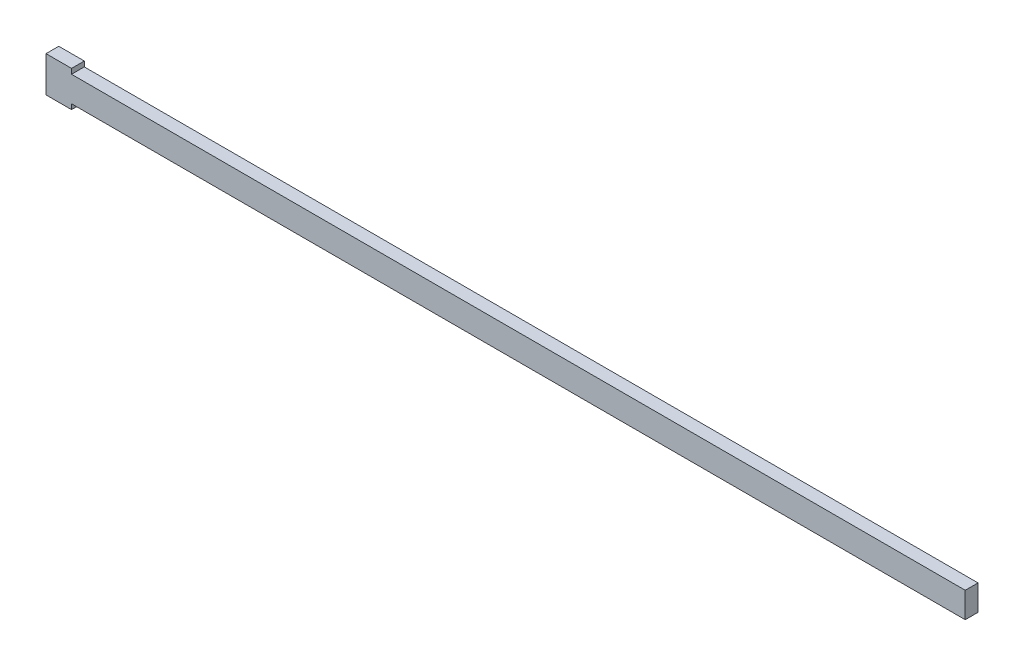
ISO-10303-21;
HEADER;
FILE_DESCRIPTION(('STEP AP214'),'2;1');
FILE_NAME('part.step','',(''),(''),'','','');
FILE_SCHEMA(('AUTOMOTIVE_DESIGN { 1 0 10303 214 1 1 1 1 }'));
ENDSEC;
DATA;
#1=APPLICATION_CONTEXT('core data for automotive mechanical design processes');
#2=APPLICATION_PROTOCOL_DEFINITION('international standard','automotive_design',2000,#1);
#3=PRODUCT_CONTEXT('',#1,'mechanical');
#4=PRODUCT('Part','Part','',(#3));
#5=PRODUCT_RELATED_PRODUCT_CATEGORY('part','',(#4));
#6=PRODUCT_DEFINITION_FORMATION('','',#4);
#7=PRODUCT_DEFINITION_CONTEXT('part definition',#1,'design');
#8=PRODUCT_DEFINITION('design','',#6,#7);
#9=PRODUCT_DEFINITION_SHAPE('','',#8);
#10=(LENGTH_UNIT() NAMED_UNIT(*) SI_UNIT(.MILLI.,.METRE.));
#11=(NAMED_UNIT(*) PLANE_ANGLE_UNIT() SI_UNIT($,.RADIAN.));
#12=(NAMED_UNIT(*) SI_UNIT($,.STERADIAN.) SOLID_ANGLE_UNIT());
#13=UNCERTAINTY_MEASURE_WITH_UNIT(LENGTH_MEASURE(1.E-05),#10,'distance_accuracy_value','');
#14=(GEOMETRIC_REPRESENTATION_CONTEXT(3) GLOBAL_UNCERTAINTY_ASSIGNED_CONTEXT((#13)) GLOBAL_UNIT_ASSIGNED_CONTEXT((#10,
#11,#12)) REPRESENTATION_CONTEXT('',''));
#15=CARTESIAN_POINT('',(0.,0.,0.));
#16=DIRECTION('',(0.,0.,1.));
#17=DIRECTION('',(1.,0.,0.));
#18=AXIS2_PLACEMENT_3D('',#15,#16,#17);
#19=CARTESIAN_POINT('',(0.,-2.54,6.35));
#20=DIRECTION('',(0.,1.,0.));
#21=DIRECTION('',(0.,0.,1.));
#22=AXIS2_PLACEMENT_3D('',#19,#20,#21);
#23=PLANE('',#22);
#24=DIRECTION('',(1.,0.,0.));
#25=VECTOR('',#24,1.);
#26=CARTESIAN_POINT('',(0.,-2.54,0.));
#27=LINE('',#26,#25);
#28=CARTESIAN_POINT('',(0.,-2.54,0.));
#29=VERTEX_POINT('',#28);
#30=CARTESIAN_POINT('',(12.7,-2.54,0.));
#31=VERTEX_POINT('',#30);
#32=EDGE_CURVE('E139',#29,#31,#27,.T.);
#33=ORIENTED_EDGE('',*,*,#32,.T.);
#34=DIRECTION('',(0.,0.,-1.));
#35=VECTOR('',#34,1.);
#36=CARTESIAN_POINT('',(12.7,-2.54,6.35));
#37=LINE('',#36,#35);
#38=CARTESIAN_POINT('',(12.7,-2.54,6.35));
#39=VERTEX_POINT('',#38);
#40=EDGE_CURVE('E46',#39,#31,#37,.T.);
#41=ORIENTED_EDGE('',*,*,#40,.F.);
#42=DIRECTION('',(1.,0.,0.));
#43=VECTOR('',#42,1.);
#44=CARTESIAN_POINT('',(0.,-2.54,6.35));
#45=LINE('',#44,#43);
#46=CARTESIAN_POINT('',(0.,-2.54,6.35));
#47=VERTEX_POINT('',#46);
#48=EDGE_CURVE('E99',#47,#39,#45,.T.);
#49=ORIENTED_EDGE('',*,*,#48,.F.);
#50=DIRECTION('',(0.,0.,-1.));
#51=VECTOR('',#50,1.);
#52=CARTESIAN_POINT('',(0.,-2.54,6.35));
#53=LINE('',#52,#51);
#54=EDGE_CURVE('E11',#47,#29,#53,.T.);
#55=ORIENTED_EDGE('',*,*,#54,.T.);
#56=EDGE_LOOP('',(#33,#41,#49,#55));
#57=FACE_BOUND('',#56,.T.);
#58=ADVANCED_FACE('F38',(#57),#23,.F.);
#59=CARTESIAN_POINT('',(12.7,0.,6.35));
#60=DIRECTION('',(-1.,0.,0.));
#61=DIRECTION('',(0.,0.,1.));
#62=AXIS2_PLACEMENT_3D('',#59,#60,#61);
#63=PLANE('',#62);
#64=DIRECTION('',(0.,1.,0.));
#65=VECTOR('',#64,1.);
#66=CARTESIAN_POINT('',(12.7,0.,0.));
#67=LINE('',#66,#65);
#68=CARTESIAN_POINT('',(12.7,0.,0.));
#69=VERTEX_POINT('',#68);
#70=EDGE_CURVE('E141',#31,#69,#67,.T.);
#71=ORIENTED_EDGE('',*,*,#70,.T.);
#72=DIRECTION('',(0.,0.,-1.));
#73=VECTOR('',#72,1.);
#74=CARTESIAN_POINT('',(12.7,0.,6.35));
#75=LINE('',#74,#73);
#76=CARTESIAN_POINT('',(12.7,0.,6.35));
#77=VERTEX_POINT('',#76);
#78=EDGE_CURVE('E158',#77,#69,#75,.T.);
#79=ORIENTED_EDGE('',*,*,#78,.F.);
#80=DIRECTION('',(0.,1.,0.));
#81=VECTOR('',#80,1.);
#82=CARTESIAN_POINT('',(12.7,0.,6.35));
#83=LINE('',#82,#81);
#84=EDGE_CURVE('E166',#39,#77,#83,.T.);
#85=ORIENTED_EDGE('',*,*,#84,.F.);
#86=ORIENTED_EDGE('',*,*,#40,.T.);
#87=EDGE_LOOP('',(#71,#79,#85,#86));
#88=FACE_BOUND('',#87,.T.);
#89=ADVANCED_FACE('F164',(#88),#63,.F.);
#90=CARTESIAN_POINT('',(12.7,0.,6.35));
#91=DIRECTION('',(0.,1.,0.));
#92=DIRECTION('',(0.,0.,1.));
#93=AXIS2_PLACEMENT_3D('',#90,#91,#92);
#94=PLANE('',#93);
#95=DIRECTION('',(1.,0.,0.));
#96=VECTOR('',#95,1.);
#97=CARTESIAN_POINT('',(12.7,0.,0.));
#98=LINE('',#97,#96);
#99=CARTESIAN_POINT('',(457.2,0.,0.));
#100=VERTEX_POINT('',#99);
#101=EDGE_CURVE('E143',#69,#100,#98,.T.);
#102=ORIENTED_EDGE('',*,*,#101,.T.);
#103=DIRECTION('',(0.,0.,-1.));
#104=VECTOR('',#103,1.);
#105=CARTESIAN_POINT('',(457.2,0.,6.35));
#106=LINE('',#105,#104);
#107=CARTESIAN_POINT('',(457.2,0.,6.35));
#108=VERTEX_POINT('',#107);
#109=EDGE_CURVE('E155',#108,#100,#106,.T.);
#110=ORIENTED_EDGE('',*,*,#109,.F.);
#111=DIRECTION('',(1.,0.,0.));
#112=VECTOR('',#111,1.);
#113=CARTESIAN_POINT('',(12.7,0.,6.35));
#114=LINE('',#113,#112);
#115=EDGE_CURVE('E176',#77,#108,#114,.T.);
#116=ORIENTED_EDGE('',*,*,#115,.F.);
#117=ORIENTED_EDGE('',*,*,#78,.T.);
#118=EDGE_LOOP('',(#102,#110,#116,#117));
#119=FACE_BOUND('',#118,.T.);
#120=ADVANCED_FACE('F172',(#119),#94,.F.);
#121=CARTESIAN_POINT('',(457.2,0.,6.35));
#122=DIRECTION('',(-1.,0.,0.));
#123=DIRECTION('',(0.,0.,1.));
#124=AXIS2_PLACEMENT_3D('',#121,#122,#123);
#125=PLANE('',#124);
#126=DIRECTION('',(0.,1.,0.));
#127=VECTOR('',#126,1.);
#128=CARTESIAN_POINT('',(457.2,0.,0.));
#129=LINE('',#128,#127);
#130=CARTESIAN_POINT('',(457.2,12.7,0.));
#131=VERTEX_POINT('',#130);
#132=EDGE_CURVE('E145',#100,#131,#129,.T.);
#133=ORIENTED_EDGE('',*,*,#132,.T.);
#134=DIRECTION('',(0.,0.,-1.));
#135=VECTOR('',#134,1.);
#136=CARTESIAN_POINT('',(457.2,12.7,6.35));
#137=LINE('',#136,#135);
#138=CARTESIAN_POINT('',(457.2,12.7,6.35));
#139=VERTEX_POINT('',#138);
#140=EDGE_CURVE('E128',#139,#131,#137,.T.);
#141=ORIENTED_EDGE('',*,*,#140,.F.);
#142=DIRECTION('',(0.,1.,0.));
#143=VECTOR('',#142,1.);
#144=CARTESIAN_POINT('',(457.2,0.,6.35));
#145=LINE('',#144,#143);
#146=EDGE_CURVE('E119',#108,#139,#145,.T.);
#147=ORIENTED_EDGE('',*,*,#146,.F.);
#148=ORIENTED_EDGE('',*,*,#109,.T.);
#149=EDGE_LOOP('',(#133,#141,#147,#148));
#150=FACE_BOUND('',#149,.T.);
#151=ADVANCED_FACE('F175',(#150),#125,.F.);
#152=CARTESIAN_POINT('',(12.7,12.7,6.35));
#153=DIRECTION('',(0.,-1.,0.));
#154=DIRECTION('',(0.,0.,-1.));
#155=AXIS2_PLACEMENT_3D('',#152,#153,#154);
#156=PLANE('',#155);
#157=DIRECTION('',(-1.,0.,0.));
#158=VECTOR('',#157,1.);
#159=CARTESIAN_POINT('',(12.7,12.7,0.));
#160=LINE('',#159,#158);
#161=CARTESIAN_POINT('',(12.7,12.7,0.));
#162=VERTEX_POINT('',#161);
#163=EDGE_CURVE('E127',#131,#162,#160,.T.);
#164=ORIENTED_EDGE('',*,*,#163,.T.);
#165=DIRECTION('',(0.,0.,-1.));
#166=VECTOR('',#165,1.);
#167=CARTESIAN_POINT('',(12.7,12.7,6.35));
#168=LINE('',#167,#166);
#169=CARTESIAN_POINT('',(12.7,12.7,6.35));
#170=VERTEX_POINT('',#169);
#171=EDGE_CURVE('E124',#170,#162,#168,.T.);
#172=ORIENTED_EDGE('',*,*,#171,.F.);
#173=DIRECTION('',(-1.,0.,0.));
#174=VECTOR('',#173,1.);
#175=CARTESIAN_POINT('',(12.7,12.7,6.35));
#176=LINE('',#175,#174);
#177=EDGE_CURVE('E113',#139,#170,#176,.T.);
#178=ORIENTED_EDGE('',*,*,#177,.F.);
#179=ORIENTED_EDGE('',*,*,#140,.T.);
#180=EDGE_LOOP('',(#164,#172,#178,#179));
#181=FACE_BOUND('',#180,.T.);
#182=ADVANCED_FACE('F125',(#181),#156,.F.);
#183=CARTESIAN_POINT('',(12.7,12.7,6.35));
#184=DIRECTION('',(-1.,0.,0.));
#185=DIRECTION('',(0.,0.,1.));
#186=AXIS2_PLACEMENT_3D('',#183,#184,#185);
#187=PLANE('',#186);
#188=DIRECTION('',(0.,1.,0.));
#189=VECTOR('',#188,1.);
#190=CARTESIAN_POINT('',(12.7,12.7,0.));
#191=LINE('',#190,#189);
#192=CARTESIAN_POINT('',(12.7,15.24,0.));
#193=VERTEX_POINT('',#192);
#194=EDGE_CURVE('E84',#162,#193,#191,.T.);
#195=ORIENTED_EDGE('',*,*,#194,.T.);
#196=DIRECTION('',(0.,0.,-1.));
#197=VECTOR('',#196,1.);
#198=CARTESIAN_POINT('',(12.7,15.24,6.35));
#199=LINE('',#198,#197);
#200=CARTESIAN_POINT('',(12.7,15.24,6.35));
#201=VERTEX_POINT('',#200);
#202=EDGE_CURVE('E129',#201,#193,#199,.T.);
#203=ORIENTED_EDGE('',*,*,#202,.F.);
#204=DIRECTION('',(0.,1.,0.));
#205=VECTOR('',#204,1.);
#206=CARTESIAN_POINT('',(12.7,12.7,6.35));
#207=LINE('',#206,#205);
#208=EDGE_CURVE('E117',#170,#201,#207,.T.);
#209=ORIENTED_EDGE('',*,*,#208,.F.);
#210=ORIENTED_EDGE('',*,*,#171,.T.);
#211=EDGE_LOOP('',(#195,#203,#209,#210));
#212=FACE_BOUND('',#211,.T.);
#213=ADVANCED_FACE('F131',(#212),#187,.F.);
#214=CARTESIAN_POINT('',(0.,15.24,6.35));
#215=DIRECTION('',(0.,-1.,0.));
#216=DIRECTION('',(0.,0.,-1.));
#217=AXIS2_PLACEMENT_3D('',#214,#215,#216);
#218=PLANE('',#217);
#219=DIRECTION('',(-1.,0.,0.));
#220=VECTOR('',#219,1.);
#221=CARTESIAN_POINT('',(0.,15.24,0.));
#222=LINE('',#221,#220);
#223=CARTESIAN_POINT('',(0.,15.24,0.));
#224=VERTEX_POINT('',#223);
#225=EDGE_CURVE('E149',#193,#224,#222,.T.);
#226=ORIENTED_EDGE('',*,*,#225,.T.);
#227=DIRECTION('',(0.,0.,-1.));
#228=VECTOR('',#227,1.);
#229=CARTESIAN_POINT('',(0.,15.24,6.35));
#230=LINE('',#229,#228);
#231=CARTESIAN_POINT('',(0.,15.24,6.35));
#232=VERTEX_POINT('',#231);
#233=EDGE_CURVE('E135',#232,#224,#230,.T.);
#234=ORIENTED_EDGE('',*,*,#233,.F.);
#235=DIRECTION('',(-1.,0.,0.));
#236=VECTOR('',#235,1.);
#237=CARTESIAN_POINT('',(0.,15.24,6.35));
#238=LINE('',#237,#236);
#239=EDGE_CURVE('E133',#201,#232,#238,.T.);
#240=ORIENTED_EDGE('',*,*,#239,.F.);
#241=ORIENTED_EDGE('',*,*,#202,.T.);
#242=EDGE_LOOP('',(#226,#234,#240,#241));
#243=FACE_BOUND('',#242,.T.);
#244=ADVANCED_FACE('F198',(#243),#218,.F.);
#245=CARTESIAN_POINT('',(0.,0.,6.35));
#246=DIRECTION('',(1.,0.,0.));
#247=DIRECTION('',(0.,0.,-1.));
#248=AXIS2_PLACEMENT_3D('',#245,#246,#247);
#249=PLANE('',#248);
#250=DIRECTION('',(0.,-1.,0.));
#251=VECTOR('',#250,1.);
#252=CARTESIAN_POINT('',(0.,0.,0.));
#253=LINE('',#252,#251);
#254=EDGE_CURVE('E91',#224,#29,#253,.T.);
#255=ORIENTED_EDGE('',*,*,#254,.T.);
#256=ORIENTED_EDGE('',*,*,#54,.F.);
#257=DIRECTION('',(0.,-1.,0.));
#258=VECTOR('',#257,1.);
#259=CARTESIAN_POINT('',(0.,-2.54,6.35));
#260=LINE('',#259,#258);
#261=EDGE_CURVE('E54',#232,#47,#260,.T.);
#262=ORIENTED_EDGE('',*,*,#261,.F.);
#263=ORIENTED_EDGE('',*,*,#233,.T.);
#264=EDGE_LOOP('',(#255,#256,#262,#263));
#265=FACE_BOUND('',#264,.T.);
#266=ADVANCED_FACE('F182',(#265),#249,.F.);
#267=CARTESIAN_POINT('',(0.,0.,6.35));
#268=DIRECTION('',(0.,0.,-1.));
#269=DIRECTION('',(-1.,0.,0.));
#270=AXIS2_PLACEMENT_3D('',#267,#268,#269);
#271=PLANE('',#270);
#272=ORIENTED_EDGE('',*,*,#261,.T.);
#273=ORIENTED_EDGE('',*,*,#48,.T.);
#274=ORIENTED_EDGE('',*,*,#84,.T.);
#275=ORIENTED_EDGE('',*,*,#115,.T.);
#276=ORIENTED_EDGE('',*,*,#146,.T.);
#277=ORIENTED_EDGE('',*,*,#177,.T.);
#278=ORIENTED_EDGE('',*,*,#208,.T.);
#279=ORIENTED_EDGE('',*,*,#239,.T.);
#280=EDGE_LOOP('',(#272,#273,#274,#275,#276,#277,#278,#279));
#281=FACE_BOUND('',#280,.T.);
#282=ADVANCED_FACE('F115',(#281),#271,.F.);
#283=CARTESIAN_POINT('',(0.,0.,0.));
#284=DIRECTION('',(0.,0.,-1.));
#285=DIRECTION('',(-1.,0.,0.));
#286=AXIS2_PLACEMENT_3D('',#283,#284,#285);
#287=PLANE('',#286);
#288=ORIENTED_EDGE('',*,*,#32,.F.);
#289=ORIENTED_EDGE('',*,*,#254,.F.);
#290=ORIENTED_EDGE('',*,*,#225,.F.);
#291=ORIENTED_EDGE('',*,*,#194,.F.);
#292=ORIENTED_EDGE('',*,*,#163,.F.);
#293=ORIENTED_EDGE('',*,*,#132,.F.);
#294=ORIENTED_EDGE('',*,*,#101,.F.);
#295=ORIENTED_EDGE('',*,*,#70,.F.);
#296=EDGE_LOOP('',(#288,#289,#290,#291,#292,#293,#294,#295));
#297=FACE_BOUND('',#296,.T.);
#298=ADVANCED_FACE('F168',(#297),#287,.T.);
#299=CLOSED_SHELL('',(#58,#89,#120,#151,#182,#213,#244,#266,#282,#298));
#300=MANIFOLD_SOLID_BREP('B2',#299);
#301=ADVANCED_BREP_SHAPE_REPRESENTATION('',(#18,#300),#14);
#302=SHAPE_DEFINITION_REPRESENTATION(#9,#301);
ENDSEC;
END-ISO-10303-21;
